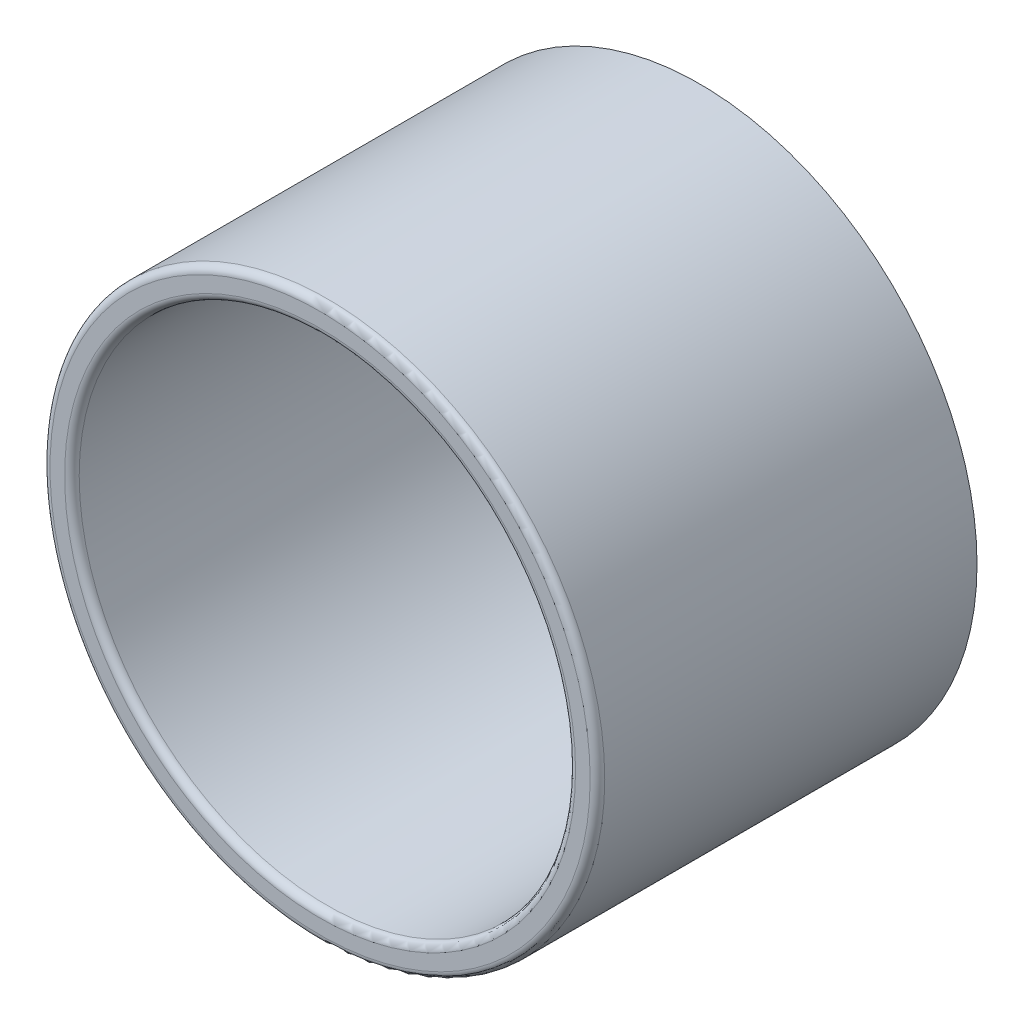
ISO-10303-21;
HEADER;
FILE_DESCRIPTION(('STEP AP214'),'2;1');
FILE_NAME('part.step','',(''),(''),'','','');
FILE_SCHEMA(('AUTOMOTIVE_DESIGN { 1 0 10303 214 1 1 1 1 }'));
ENDSEC;
DATA;
#1=APPLICATION_CONTEXT('core data for automotive mechanical design processes');
#2=APPLICATION_PROTOCOL_DEFINITION('international standard','automotive_design',2000,#1);
#3=PRODUCT_CONTEXT('',#1,'mechanical');
#4=PRODUCT('Part','Part','',(#3));
#5=PRODUCT_RELATED_PRODUCT_CATEGORY('part','',(#4));
#6=PRODUCT_DEFINITION_FORMATION('','',#4);
#7=PRODUCT_DEFINITION_CONTEXT('part definition',#1,'design');
#8=PRODUCT_DEFINITION('design','',#6,#7);
#9=PRODUCT_DEFINITION_SHAPE('','',#8);
#10=(LENGTH_UNIT() NAMED_UNIT(*) SI_UNIT(.MILLI.,.METRE.));
#11=(NAMED_UNIT(*) PLANE_ANGLE_UNIT() SI_UNIT($,.RADIAN.));
#12=(NAMED_UNIT(*) SI_UNIT($,.STERADIAN.) SOLID_ANGLE_UNIT());
#13=UNCERTAINTY_MEASURE_WITH_UNIT(LENGTH_MEASURE(1.E-05),#10,'distance_accuracy_value','');
#14=(GEOMETRIC_REPRESENTATION_CONTEXT(3) GLOBAL_UNCERTAINTY_ASSIGNED_CONTEXT((#13)) GLOBAL_UNIT_ASSIGNED_CONTEXT((#10,
#11,#12)) REPRESENTATION_CONTEXT('',''));
#15=CARTESIAN_POINT('',(0.,0.,0.));
#16=DIRECTION('',(0.,0.,1.));
#17=DIRECTION('',(1.,0.,0.));
#18=AXIS2_PLACEMENT_3D('',#15,#16,#17);
#19=CARTESIAN_POINT('',(0.,0.,-26.));
#20=DIRECTION('',(0.,0.,1.));
#21=DIRECTION('',(1.,0.,0.));
#22=AXIS2_PLACEMENT_3D('',#19,#20,#21);
#23=CYLINDRICAL_SURFACE('',#22,19.);
#24=CARTESIAN_POINT('',(0.,0.,-0.5));
#25=DIRECTION('',(0.,0.,1.));
#26=DIRECTION('',(1.,0.,0.));
#27=AXIS2_PLACEMENT_3D('',#24,#25,#26);
#28=CIRCLE('',#27,19.);
#29=CARTESIAN_POINT('',(19.,0.,-0.5));
#30=VERTEX_POINT('',#29);
#31=EDGE_CURVE('E10',#30,#30,#28,.F.);
#32=ORIENTED_EDGE('',*,*,#31,.T.);
#33=EDGE_LOOP('',(#32));
#34=FACE_BOUND('',#33,.T.);
#35=CARTESIAN_POINT('',(0.,0.,-26.));
#36=DIRECTION('',(0.,0.,1.));
#37=DIRECTION('',(1.,0.,0.));
#38=AXIS2_PLACEMENT_3D('',#35,#36,#37);
#39=CIRCLE('',#38,19.);
#40=CARTESIAN_POINT('',(19.,0.,-26.));
#41=VERTEX_POINT('',#40);
#42=EDGE_CURVE('E56',#41,#41,#39,.T.);
#43=ORIENTED_EDGE('',*,*,#42,.T.);
#44=EDGE_LOOP('',(#43));
#45=FACE_BOUND('',#44,.T.);
#46=ADVANCED_FACE('F39',(#34,#45),#23,.T.);
#47=CARTESIAN_POINT('',(0.,0.,-26.));
#48=DIRECTION('',(0.,0.,1.));
#49=DIRECTION('',(1.,0.,0.));
#50=AXIS2_PLACEMENT_3D('',#47,#48,#49);
#51=PLANE('',#50);
#52=CARTESIAN_POINT('',(0.,0.,-26.));
#53=DIRECTION('',(0.,0.,1.));
#54=DIRECTION('',(1.,0.,0.));
#55=AXIS2_PLACEMENT_3D('',#52,#53,#54);
#56=CIRCLE('',#55,17.);
#57=CARTESIAN_POINT('',(17.,0.,-26.));
#58=VERTEX_POINT('',#57);
#59=EDGE_CURVE('E61',#58,#58,#56,.T.);
#60=ORIENTED_EDGE('',*,*,#59,.T.);
#61=EDGE_LOOP('',(#60));
#62=FACE_BOUND('',#61,.T.);
#63=ORIENTED_EDGE('',*,*,#42,.F.);
#64=EDGE_LOOP('',(#63));
#65=FACE_BOUND('',#64,.T.);
#66=ADVANCED_FACE('F68',(#62,#65),#51,.F.);
#67=CARTESIAN_POINT('',(0.,0.,0.));
#68=DIRECTION('',(0.,0.,1.));
#69=DIRECTION('',(1.,0.,0.));
#70=AXIS2_PLACEMENT_3D('',#67,#68,#69);
#71=PLANE('',#70);
#72=CARTESIAN_POINT('',(0.,0.,0.));
#73=DIRECTION('',(0.,0.,1.));
#74=DIRECTION('',(1.,0.,0.));
#75=AXIS2_PLACEMENT_3D('',#72,#73,#74);
#76=CIRCLE('',#75,17.5);
#77=CARTESIAN_POINT('',(17.5,0.,0.));
#78=VERTEX_POINT('',#77);
#79=EDGE_CURVE('E46',#78,#78,#76,.F.);
#80=ORIENTED_EDGE('',*,*,#79,.T.);
#81=EDGE_LOOP('',(#80));
#82=FACE_BOUND('',#81,.T.);
#83=CARTESIAN_POINT('',(0.,0.,0.));
#84=DIRECTION('',(0.,0.,1.));
#85=DIRECTION('',(1.,0.,0.));
#86=AXIS2_PLACEMENT_3D('',#83,#84,#85);
#87=CIRCLE('',#86,18.5);
#88=CARTESIAN_POINT('',(18.5,0.,0.));
#89=VERTEX_POINT('',#88);
#90=EDGE_CURVE('E49',#89,#89,#87,.T.);
#91=ORIENTED_EDGE('',*,*,#90,.T.);
#92=EDGE_LOOP('',(#91));
#93=FACE_BOUND('',#92,.T.);
#94=ADVANCED_FACE('F75',(#82,#93),#71,.T.);
#95=CARTESIAN_POINT('',(0.,0.,-26.));
#96=DIRECTION('',(0.,0.,1.));
#97=DIRECTION('',(1.,0.,0.));
#98=AXIS2_PLACEMENT_3D('',#95,#96,#97);
#99=CYLINDRICAL_SURFACE('',#98,17.);
#100=CARTESIAN_POINT('',(0.,0.,-0.5));
#101=DIRECTION('',(0.,0.,1.));
#102=DIRECTION('',(1.,0.,0.));
#103=AXIS2_PLACEMENT_3D('',#100,#101,#102);
#104=CIRCLE('',#103,17.);
#105=CARTESIAN_POINT('',(17.,0.,-0.5));
#106=VERTEX_POINT('',#105);
#107=EDGE_CURVE('E53',#106,#106,#104,.T.);
#108=ORIENTED_EDGE('',*,*,#107,.T.);
#109=EDGE_LOOP('',(#108));
#110=FACE_BOUND('',#109,.T.);
#111=ORIENTED_EDGE('',*,*,#59,.F.);
#112=EDGE_LOOP('',(#111));
#113=FACE_BOUND('',#112,.T.);
#114=ADVANCED_FACE('F67',(#110,#113),#99,.F.);
#115=CARTESIAN_POINT('',(0.,0.,-0.5));
#116=DIRECTION('',(0.,0.,1.));
#117=DIRECTION('',(1.,0.,0.));
#118=AXIS2_PLACEMENT_3D('',#115,#116,#117);
#119=TOROIDAL_SURFACE('',#118,17.5,0.5);
#120=ORIENTED_EDGE('',*,*,#79,.F.);
#121=EDGE_LOOP('',(#120));
#122=FACE_BOUND('',#121,.T.);
#123=ORIENTED_EDGE('',*,*,#107,.F.);
#124=EDGE_LOOP('',(#123));
#125=FACE_BOUND('',#124,.T.);
#126=ADVANCED_FACE('F72',(#122,#125),#119,.T.);
#127=CARTESIAN_POINT('',(0.,0.,-0.5));
#128=DIRECTION('',(0.,0.,1.));
#129=DIRECTION('',(1.,0.,0.));
#130=AXIS2_PLACEMENT_3D('',#127,#128,#129);
#131=TOROIDAL_SURFACE('',#130,18.5,0.5);
#132=ORIENTED_EDGE('',*,*,#31,.F.);
#133=EDGE_LOOP('',(#132));
#134=FACE_BOUND('',#133,.T.);
#135=ORIENTED_EDGE('',*,*,#90,.F.);
#136=EDGE_LOOP('',(#135));
#137=FACE_BOUND('',#136,.T.);
#138=ADVANCED_FACE('F41',(#134,#137),#131,.T.);
#139=CLOSED_SHELL('',(#46,#66,#94,#114,#126,#138));
#140=MANIFOLD_SOLID_BREP('B2',#139);
#141=ADVANCED_BREP_SHAPE_REPRESENTATION('',(#18,#140),#14);
#142=SHAPE_DEFINITION_REPRESENTATION(#9,#141);
ENDSEC;
END-ISO-10303-21;
